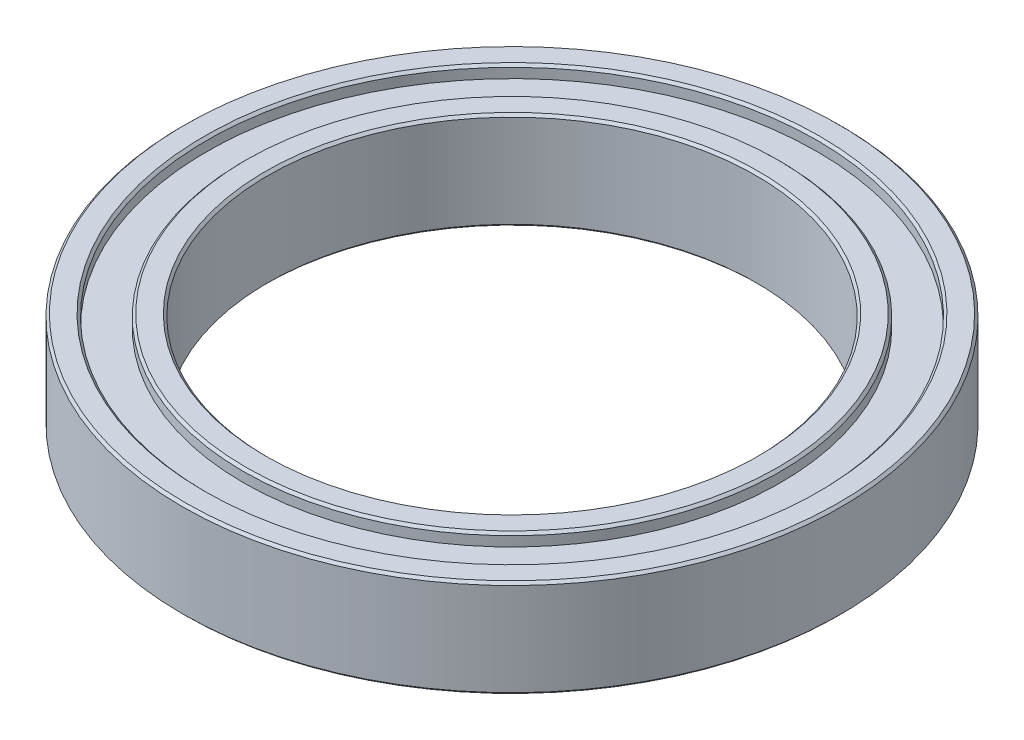
ISO-10303-21;
HEADER;
FILE_DESCRIPTION(('STEP AP214'),'2;1');
FILE_NAME('part.step','',(''),(''),'','','');
FILE_SCHEMA(('AUTOMOTIVE_DESIGN { 1 0 10303 214 1 1 1 1 }'));
ENDSEC;
DATA;
#1=APPLICATION_CONTEXT('core data for automotive mechanical design processes');
#2=APPLICATION_PROTOCOL_DEFINITION('international standard','automotive_design',2000,#1);
#3=PRODUCT_CONTEXT('',#1,'mechanical');
#4=PRODUCT('Part','Part','',(#3));
#5=PRODUCT_RELATED_PRODUCT_CATEGORY('part','',(#4));
#6=PRODUCT_DEFINITION_FORMATION('','',#4);
#7=PRODUCT_DEFINITION_CONTEXT('part definition',#1,'design');
#8=PRODUCT_DEFINITION('design','',#6,#7);
#9=PRODUCT_DEFINITION_SHAPE('','',#8);
#10=(LENGTH_UNIT() NAMED_UNIT(*) SI_UNIT(.MILLI.,.METRE.));
#11=(NAMED_UNIT(*) PLANE_ANGLE_UNIT() SI_UNIT($,.RADIAN.));
#12=(NAMED_UNIT(*) SI_UNIT($,.STERADIAN.) SOLID_ANGLE_UNIT());
#13=UNCERTAINTY_MEASURE_WITH_UNIT(LENGTH_MEASURE(1.E-05),#10,'distance_accuracy_value','');
#14=(GEOMETRIC_REPRESENTATION_CONTEXT(3) GLOBAL_UNCERTAINTY_ASSIGNED_CONTEXT((#13)) GLOBAL_UNIT_ASSIGNED_CONTEXT((#10,
#11,#12)) REPRESENTATION_CONTEXT('',''));
#15=CARTESIAN_POINT('',(0.,0.,0.));
#16=DIRECTION('',(0.,0.,1.));
#17=DIRECTION('',(1.,0.,0.));
#18=AXIS2_PLACEMENT_3D('',#15,#16,#17);
#19=CARTESIAN_POINT('',(0.,0.,0.));
#20=DIRECTION('',(0.,1.,0.));
#21=DIRECTION('',(0.,0.,1.));
#22=AXIS2_PLACEMENT_3D('',#19,#20,#21);
#23=PLANE('',#22);
#24=CARTESIAN_POINT('',(0.,0.,0.));
#25=DIRECTION('',(0.,1.,0.));
#26=DIRECTION('',(0.,0.,1.));
#27=AXIS2_PLACEMENT_3D('',#24,#25,#26);
#28=CIRCLE('',#27,10.1);
#29=CARTESIAN_POINT('',(0.,0.,10.1));
#30=VERTEX_POINT('',#29);
#31=EDGE_CURVE('E86',#30,#30,#28,.T.);
#32=ORIENTED_EDGE('',*,*,#31,.T.);
#33=EDGE_LOOP('',(#32));
#34=FACE_BOUND('',#33,.T.);
#35=CARTESIAN_POINT('',(0.,0.,0.));
#36=DIRECTION('',(0.,1.,0.));
#37=DIRECTION('',(0.,0.,1.));
#38=AXIS2_PLACEMENT_3D('',#35,#36,#37);
#39=CIRCLE('',#38,10.9);
#40=CARTESIAN_POINT('',(0.,0.,10.9));
#41=VERTEX_POINT('',#40);
#42=EDGE_CURVE('E89',#41,#41,#39,.F.);
#43=ORIENTED_EDGE('',*,*,#42,.T.);
#44=EDGE_LOOP('',(#43));
#45=FACE_BOUND('',#44,.T.);
#46=ADVANCED_FACE('F35',(#34,#45),#23,.F.);
#47=CARTESIAN_POINT('',(0.,4.,0.));
#48=DIRECTION('',(0.,1.,0.));
#49=DIRECTION('',(0.,0.,1.));
#50=AXIS2_PLACEMENT_3D('',#47,#48,#49);
#51=PLANE('',#50);
#52=CARTESIAN_POINT('',(0.,4.,0.));
#53=DIRECTION('',(0.,1.,0.));
#54=DIRECTION('',(0.,0.,1.));
#55=AXIS2_PLACEMENT_3D('',#52,#53,#54);
#56=CIRCLE('',#55,10.1);
#57=CARTESIAN_POINT('',(0.,4.,10.1));
#58=VERTEX_POINT('',#57);
#59=EDGE_CURVE('E56',#58,#58,#56,.F.);
#60=ORIENTED_EDGE('',*,*,#59,.T.);
#61=EDGE_LOOP('',(#60));
#62=FACE_BOUND('',#61,.T.);
#63=CARTESIAN_POINT('',(0.,4.,0.));
#64=DIRECTION('',(0.,1.,0.));
#65=DIRECTION('',(0.,0.,1.));
#66=AXIS2_PLACEMENT_3D('',#63,#64,#65);
#67=CIRCLE('',#66,10.9);
#68=CARTESIAN_POINT('',(0.,4.,10.9));
#69=VERTEX_POINT('',#68);
#70=EDGE_CURVE('E59',#69,#69,#67,.T.);
#71=ORIENTED_EDGE('',*,*,#70,.T.);
#72=EDGE_LOOP('',(#71));
#73=FACE_BOUND('',#72,.T.);
#74=ADVANCED_FACE('F124',(#62,#73),#51,.T.);
#75=CARTESIAN_POINT('',(0.,4.,0.));
#76=DIRECTION('',(0.,1.,0.));
#77=DIRECTION('',(0.,0.,1.));
#78=AXIS2_PLACEMENT_3D('',#75,#76,#77);
#79=CIRCLE('',#78,12.6);
#80=CARTESIAN_POINT('',(0.,4.,12.6));
#81=VERTEX_POINT('',#80);
#82=EDGE_CURVE('E10',#81,#81,#79,.F.);
#83=ORIENTED_EDGE('',*,*,#82,.T.);
#84=EDGE_LOOP('',(#83));
#85=FACE_BOUND('',#84,.T.);
#86=CARTESIAN_POINT('',(0.,4.,0.));
#87=DIRECTION('',(0.,1.,0.));
#88=DIRECTION('',(0.,0.,1.));
#89=AXIS2_PLACEMENT_3D('',#86,#87,#88);
#90=CIRCLE('',#89,13.4);
#91=CARTESIAN_POINT('',(0.,4.,13.4));
#92=VERTEX_POINT('',#91);
#93=EDGE_CURVE('E43',#92,#92,#90,.T.);
#94=ORIENTED_EDGE('',*,*,#93,.T.);
#95=EDGE_LOOP('',(#94));
#96=FACE_BOUND('',#95,.T.);
#97=ADVANCED_FACE('F131',(#85,#96),#51,.T.);
#98=CARTESIAN_POINT('',(0.,0.,0.));
#99=DIRECTION('',(0.,1.,0.));
#100=DIRECTION('',(0.,0.,1.));
#101=AXIS2_PLACEMENT_3D('',#98,#99,#100);
#102=CIRCLE('',#101,12.6);
#103=CARTESIAN_POINT('',(0.,0.,12.6));
#104=VERTEX_POINT('',#103);
#105=EDGE_CURVE('E71',#104,#104,#102,.T.);
#106=ORIENTED_EDGE('',*,*,#105,.T.);
#107=EDGE_LOOP('',(#106));
#108=FACE_BOUND('',#107,.T.);
#109=CARTESIAN_POINT('',(0.,0.,0.));
#110=DIRECTION('',(0.,1.,0.));
#111=DIRECTION('',(0.,0.,1.));
#112=AXIS2_PLACEMENT_3D('',#109,#110,#111);
#113=CIRCLE('',#112,13.4);
#114=CARTESIAN_POINT('',(0.,0.,13.4));
#115=VERTEX_POINT('',#114);
#116=EDGE_CURVE('E74',#115,#115,#113,.F.);
#117=ORIENTED_EDGE('',*,*,#116,.T.);
#118=EDGE_LOOP('',(#117));
#119=FACE_BOUND('',#118,.T.);
#120=ADVANCED_FACE('F127',(#108,#119),#23,.F.);
#121=CARTESIAN_POINT('',(0.,4.,0.));
#122=DIRECTION('',(0.,-1.,0.));
#123=DIRECTION('',(0.,0.,-1.));
#124=AXIS2_PLACEMENT_3D('',#121,#122,#123);
#125=CYLINDRICAL_SURFACE('',#124,13.5);
#126=CARTESIAN_POINT('',(0.,0.0999999999999977,0.));
#127=DIRECTION('',(0.,1.,0.));
#128=DIRECTION('',(0.,0.,1.));
#129=AXIS2_PLACEMENT_3D('',#126,#127,#128);
#130=CIRCLE('',#129,13.5);
#131=CARTESIAN_POINT('',(0.,0.0999999999999977,13.5));
#132=VERTEX_POINT('',#131);
#133=EDGE_CURVE('E62',#132,#132,#130,.T.);
#134=ORIENTED_EDGE('',*,*,#133,.T.);
#135=EDGE_LOOP('',(#134));
#136=FACE_BOUND('',#135,.T.);
#137=CARTESIAN_POINT('',(0.,3.9,0.));
#138=DIRECTION('',(0.,1.,0.));
#139=DIRECTION('',(0.,0.,1.));
#140=AXIS2_PLACEMENT_3D('',#137,#138,#139);
#141=CIRCLE('',#140,13.5);
#142=CARTESIAN_POINT('',(0.,3.9,13.5));
#143=VERTEX_POINT('',#142);
#144=EDGE_CURVE('E65',#143,#143,#141,.F.);
#145=ORIENTED_EDGE('',*,*,#144,.T.);
#146=EDGE_LOOP('',(#145));
#147=FACE_BOUND('',#146,.T.);
#148=ADVANCED_FACE('F137',(#136,#147),#125,.T.);
#149=CARTESIAN_POINT('',(0.,4.,0.));
#150=DIRECTION('',(0.,-1.,0.));
#151=DIRECTION('',(0.,0.,-1.));
#152=AXIS2_PLACEMENT_3D('',#149,#150,#151);
#153=CYLINDRICAL_SURFACE('',#152,10.);
#154=CARTESIAN_POINT('',(0.,0.100000000000001,0.));
#155=DIRECTION('',(0.,1.,0.));
#156=DIRECTION('',(0.,0.,1.));
#157=AXIS2_PLACEMENT_3D('',#154,#155,#156);
#158=CIRCLE('',#157,10.);
#159=CARTESIAN_POINT('',(0.,0.100000000000001,10.));
#160=VERTEX_POINT('',#159);
#161=EDGE_CURVE('E80',#160,#160,#158,.F.);
#162=ORIENTED_EDGE('',*,*,#161,.T.);
#163=EDGE_LOOP('',(#162));
#164=FACE_BOUND('',#163,.T.);
#165=CARTESIAN_POINT('',(0.,3.9,0.));
#166=DIRECTION('',(0.,1.,0.));
#167=DIRECTION('',(0.,0.,1.));
#168=AXIS2_PLACEMENT_3D('',#165,#166,#167);
#169=CIRCLE('',#168,10.);
#170=CARTESIAN_POINT('',(0.,3.9,10.));
#171=VERTEX_POINT('',#170);
#172=EDGE_CURVE('E83',#171,#171,#169,.T.);
#173=ORIENTED_EDGE('',*,*,#172,.T.);
#174=EDGE_LOOP('',(#173));
#175=FACE_BOUND('',#174,.T.);
#176=ADVANCED_FACE('F143',(#164,#175),#153,.F.);
#177=CARTESIAN_POINT('',(0.,3.5,0.));
#178=DIRECTION('',(0.,1.,0.));
#179=DIRECTION('',(0.,0.,1.));
#180=AXIS2_PLACEMENT_3D('',#177,#178,#179);
#181=CYLINDRICAL_SURFACE('',#180,12.5);
#182=CARTESIAN_POINT('',(0.,3.9,0.));
#183=DIRECTION('',(0.,1.,0.));
#184=DIRECTION('',(0.,0.,1.));
#185=AXIS2_PLACEMENT_3D('',#182,#183,#184);
#186=CIRCLE('',#185,12.5);
#187=CARTESIAN_POINT('',(0.,3.9,12.5));
#188=VERTEX_POINT('',#187);
#189=EDGE_CURVE('E47',#188,#188,#186,.T.);
#190=ORIENTED_EDGE('',*,*,#189,.T.);
#191=EDGE_LOOP('',(#190));
#192=FACE_BOUND('',#191,.T.);
#193=CARTESIAN_POINT('',(0.,3.5,0.));
#194=DIRECTION('',(0.,1.,0.));
#195=DIRECTION('',(0.,0.,1.));
#196=AXIS2_PLACEMENT_3D('',#193,#194,#195);
#197=CIRCLE('',#196,12.5);
#198=CARTESIAN_POINT('',(0.,3.5,12.5));
#199=VERTEX_POINT('',#198);
#200=EDGE_CURVE('E92',#199,#199,#197,.T.);
#201=ORIENTED_EDGE('',*,*,#200,.F.);
#202=EDGE_LOOP('',(#201));
#203=FACE_BOUND('',#202,.T.);
#204=ADVANCED_FACE('F288',(#192,#203),#181,.F.);
#205=CARTESIAN_POINT('',(0.,3.5,0.));
#206=DIRECTION('',(0.,1.,0.));
#207=DIRECTION('',(0.,0.,1.));
#208=AXIS2_PLACEMENT_3D('',#205,#206,#207);
#209=PLANE('',#208);
#210=CARTESIAN_POINT('',(0.,3.5,0.));
#211=DIRECTION('',(0.,1.,0.));
#212=DIRECTION('',(0.,0.,1.));
#213=AXIS2_PLACEMENT_3D('',#210,#211,#212);
#214=CIRCLE('',#213,11.);
#215=CARTESIAN_POINT('',(0.,3.5,11.));
#216=VERTEX_POINT('',#215);
#217=EDGE_CURVE('E95',#216,#216,#214,.T.);
#218=ORIENTED_EDGE('',*,*,#217,.F.);
#219=EDGE_LOOP('',(#218));
#220=FACE_BOUND('',#219,.T.);
#221=ORIENTED_EDGE('',*,*,#200,.T.);
#222=EDGE_LOOP('',(#221));
#223=FACE_BOUND('',#222,.T.);
#224=ADVANCED_FACE('F279',(#220,#223),#209,.T.);
#225=CARTESIAN_POINT('',(0.,3.5,0.));
#226=DIRECTION('',(0.,1.,0.));
#227=DIRECTION('',(0.,0.,1.));
#228=AXIS2_PLACEMENT_3D('',#225,#226,#227);
#229=CYLINDRICAL_SURFACE('',#228,11.);
#230=CARTESIAN_POINT('',(0.,3.89999999999999,0.));
#231=DIRECTION('',(0.,1.,0.));
#232=DIRECTION('',(0.,0.,1.));
#233=AXIS2_PLACEMENT_3D('',#230,#231,#232);
#234=CIRCLE('',#233,11.);
#235=CARTESIAN_POINT('',(0.,3.89999999999999,11.));
#236=VERTEX_POINT('',#235);
#237=EDGE_CURVE('E51',#236,#236,#234,.F.);
#238=ORIENTED_EDGE('',*,*,#237,.T.);
#239=EDGE_LOOP('',(#238));
#240=FACE_BOUND('',#239,.T.);
#241=ORIENTED_EDGE('',*,*,#217,.T.);
#242=EDGE_LOOP('',(#241));
#243=FACE_BOUND('',#242,.T.);
#244=ADVANCED_FACE('F266',(#240,#243),#229,.T.);
#245=CARTESIAN_POINT('',(0.,0.5,0.));
#246=DIRECTION('',(0.,-1.,0.));
#247=DIRECTION('',(0.,0.,1.));
#248=AXIS2_PLACEMENT_3D('',#245,#246,#247);
#249=PLANE('',#248);
#250=CARTESIAN_POINT('',(0.,0.5,0.));
#251=DIRECTION('',(0.,1.,0.));
#252=DIRECTION('',(0.,0.,1.));
#253=AXIS2_PLACEMENT_3D('',#250,#251,#252);
#254=CIRCLE('',#253,12.5);
#255=CARTESIAN_POINT('',(0.,0.5,12.5));
#256=VERTEX_POINT('',#255);
#257=EDGE_CURVE('E98',#256,#256,#254,.T.);
#258=ORIENTED_EDGE('',*,*,#257,.F.);
#259=EDGE_LOOP('',(#258));
#260=FACE_BOUND('',#259,.T.);
#261=CARTESIAN_POINT('',(0.,0.5,0.));
#262=DIRECTION('',(0.,1.,0.));
#263=DIRECTION('',(0.,0.,1.));
#264=AXIS2_PLACEMENT_3D('',#261,#262,#263);
#265=CIRCLE('',#264,11.);
#266=CARTESIAN_POINT('',(0.,0.5,11.));
#267=VERTEX_POINT('',#266);
#268=EDGE_CURVE('E101',#267,#267,#265,.T.);
#269=ORIENTED_EDGE('',*,*,#268,.T.);
#270=EDGE_LOOP('',(#269));
#271=FACE_BOUND('',#270,.T.);
#272=ADVANCED_FACE('F105',(#260,#271),#249,.T.);
#273=CARTESIAN_POINT('',(0.,0.5,0.));
#274=DIRECTION('',(0.,-1.,0.));
#275=DIRECTION('',(0.,0.,-1.));
#276=AXIS2_PLACEMENT_3D('',#273,#274,#275);
#277=CYLINDRICAL_SURFACE('',#276,12.5);
#278=CARTESIAN_POINT('',(0.,0.0999999999999959,0.));
#279=DIRECTION('',(0.,1.,0.));
#280=DIRECTION('',(0.,0.,1.));
#281=AXIS2_PLACEMENT_3D('',#278,#279,#280);
#282=CIRCLE('',#281,12.5);
#283=CARTESIAN_POINT('',(0.,0.0999999999999959,12.5));
#284=VERTEX_POINT('',#283);
#285=EDGE_CURVE('E68',#284,#284,#282,.F.);
#286=ORIENTED_EDGE('',*,*,#285,.T.);
#287=EDGE_LOOP('',(#286));
#288=FACE_BOUND('',#287,.T.);
#289=ORIENTED_EDGE('',*,*,#257,.T.);
#290=EDGE_LOOP('',(#289));
#291=FACE_BOUND('',#290,.T.);
#292=ADVANCED_FACE('F110',(#288,#291),#277,.F.);
#293=CARTESIAN_POINT('',(0.,0.5,0.));
#294=DIRECTION('',(0.,-1.,0.));
#295=DIRECTION('',(0.,0.,-1.));
#296=AXIS2_PLACEMENT_3D('',#293,#294,#295);
#297=CYLINDRICAL_SURFACE('',#296,11.);
#298=CARTESIAN_POINT('',(0.,0.0999999999999959,0.));
#299=DIRECTION('',(0.,1.,0.));
#300=DIRECTION('',(0.,0.,1.));
#301=AXIS2_PLACEMENT_3D('',#298,#299,#300);
#302=CIRCLE('',#301,11.);
#303=CARTESIAN_POINT('',(0.,0.0999999999999959,11.));
#304=VERTEX_POINT('',#303);
#305=EDGE_CURVE('E77',#304,#304,#302,.T.);
#306=ORIENTED_EDGE('',*,*,#305,.T.);
#307=EDGE_LOOP('',(#306));
#308=FACE_BOUND('',#307,.T.);
#309=ORIENTED_EDGE('',*,*,#268,.F.);
#310=EDGE_LOOP('',(#309));
#311=FACE_BOUND('',#310,.T.);
#312=ADVANCED_FACE('F107',(#308,#311),#297,.T.);
#313=CARTESIAN_POINT('',(0.,0.,0.));
#314=DIRECTION('',(0.,-1.,0.));
#315=DIRECTION('',(0.,0.,-1.));
#316=AXIS2_PLACEMENT_3D('',#313,#314,#315);
#317=CONICAL_SURFACE('',#316,10.1,0.785398163397466);
#318=ORIENTED_EDGE('',*,*,#161,.F.);
#319=EDGE_LOOP('',(#318));
#320=FACE_BOUND('',#319,.T.);
#321=ORIENTED_EDGE('',*,*,#31,.F.);
#322=EDGE_LOOP('',(#321));
#323=FACE_BOUND('',#322,.T.);
#324=ADVANCED_FACE('F109',(#320,#323),#317,.F.);
#325=CARTESIAN_POINT('',(0.,0.0999999999999959,0.));
#326=DIRECTION('',(0.,1.,0.));
#327=DIRECTION('',(0.,0.,1.));
#328=AXIS2_PLACEMENT_3D('',#325,#326,#327);
#329=CONICAL_SURFACE('',#328,11.,0.785398163397448);
#330=ORIENTED_EDGE('',*,*,#42,.F.);
#331=EDGE_LOOP('',(#330));
#332=FACE_BOUND('',#331,.T.);
#333=ORIENTED_EDGE('',*,*,#305,.F.);
#334=EDGE_LOOP('',(#333));
#335=FACE_BOUND('',#334,.T.);
#336=ADVANCED_FACE('F117',(#332,#335),#329,.T.);
#337=CARTESIAN_POINT('',(0.,0.,0.));
#338=DIRECTION('',(0.,-1.,0.));
#339=DIRECTION('',(0.,0.,-1.));
#340=AXIS2_PLACEMENT_3D('',#337,#338,#339);
#341=CONICAL_SURFACE('',#340,12.6,0.785398163397466);
#342=ORIENTED_EDGE('',*,*,#285,.F.);
#343=EDGE_LOOP('',(#342));
#344=FACE_BOUND('',#343,.T.);
#345=ORIENTED_EDGE('',*,*,#105,.F.);
#346=EDGE_LOOP('',(#345));
#347=FACE_BOUND('',#346,.T.);
#348=ADVANCED_FACE('F153',(#344,#347),#341,.F.);
#349=CARTESIAN_POINT('',(0.,0.0999999999999977,0.));
#350=DIRECTION('',(0.,1.,0.));
#351=DIRECTION('',(0.,0.,1.));
#352=AXIS2_PLACEMENT_3D('',#349,#350,#351);
#353=CONICAL_SURFACE('',#352,13.5,0.785398163397457);
#354=ORIENTED_EDGE('',*,*,#116,.F.);
#355=EDGE_LOOP('',(#354));
#356=FACE_BOUND('',#355,.T.);
#357=ORIENTED_EDGE('',*,*,#133,.F.);
#358=EDGE_LOOP('',(#357));
#359=FACE_BOUND('',#358,.T.);
#360=ADVANCED_FACE('F149',(#356,#359),#353,.T.);
#361=CARTESIAN_POINT('',(0.,3.9,0.));
#362=DIRECTION('',(0.,1.,0.));
#363=DIRECTION('',(0.,0.,1.));
#364=AXIS2_PLACEMENT_3D('',#361,#362,#363);
#365=CONICAL_SURFACE('',#364,10.,0.785398163397466);
#366=ORIENTED_EDGE('',*,*,#59,.F.);
#367=EDGE_LOOP('',(#366));
#368=FACE_BOUND('',#367,.T.);
#369=ORIENTED_EDGE('',*,*,#172,.F.);
#370=EDGE_LOOP('',(#369));
#371=FACE_BOUND('',#370,.T.);
#372=ADVANCED_FACE('F152',(#368,#371),#365,.F.);
#373=CARTESIAN_POINT('',(0.,4.,0.));
#374=DIRECTION('',(0.,-1.,0.));
#375=DIRECTION('',(0.,0.,-1.));
#376=AXIS2_PLACEMENT_3D('',#373,#374,#375);
#377=CONICAL_SURFACE('',#376,10.9,0.785398163397466);
#378=ORIENTED_EDGE('',*,*,#237,.F.);
#379=EDGE_LOOP('',(#378));
#380=FACE_BOUND('',#379,.T.);
#381=ORIENTED_EDGE('',*,*,#70,.F.);
#382=EDGE_LOOP('',(#381));
#383=FACE_BOUND('',#382,.T.);
#384=ADVANCED_FACE('F165',(#380,#383),#377,.T.);
#385=CARTESIAN_POINT('',(0.,3.9,0.));
#386=DIRECTION('',(0.,1.,0.));
#387=DIRECTION('',(0.,0.,1.));
#388=AXIS2_PLACEMENT_3D('',#385,#386,#387);
#389=CONICAL_SURFACE('',#388,12.5,0.78539816339744);
#390=ORIENTED_EDGE('',*,*,#82,.F.);
#391=EDGE_LOOP('',(#390));
#392=FACE_BOUND('',#391,.T.);
#393=ORIENTED_EDGE('',*,*,#189,.F.);
#394=EDGE_LOOP('',(#393));
#395=FACE_BOUND('',#394,.T.);
#396=ADVANCED_FACE('F161',(#392,#395),#389,.F.);
#397=CARTESIAN_POINT('',(0.,4.,0.));
#398=DIRECTION('',(0.,-1.,0.));
#399=DIRECTION('',(0.,0.,-1.));
#400=AXIS2_PLACEMENT_3D('',#397,#398,#399);
#401=CONICAL_SURFACE('',#400,13.4,0.785398163397474);
#402=ORIENTED_EDGE('',*,*,#144,.F.);
#403=EDGE_LOOP('',(#402));
#404=FACE_BOUND('',#403,.T.);
#405=ORIENTED_EDGE('',*,*,#93,.F.);
#406=EDGE_LOOP('',(#405));
#407=FACE_BOUND('',#406,.T.);
#408=ADVANCED_FACE('F38',(#404,#407),#401,.T.);
#409=CLOSED_SHELL('',(#46,#74,#97,#120,#148,#176,#204,#224,#244,#272,#292,#312,#324,#336,#348,
#360,#372,#384,#396,#408));
#410=MANIFOLD_SOLID_BREP('B2',#409);
#411=ADVANCED_BREP_SHAPE_REPRESENTATION('',(#18,#410),#14);
#412=SHAPE_DEFINITION_REPRESENTATION(#9,#411);
ENDSEC;
END-ISO-10303-21;
